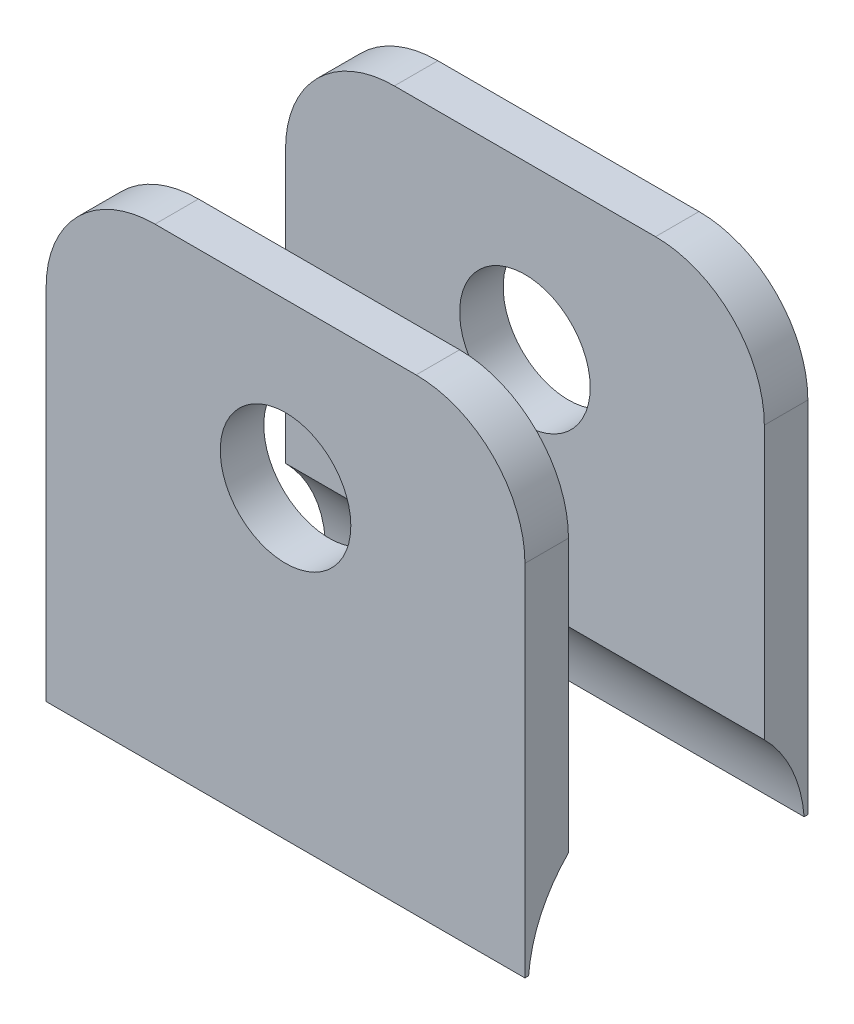
ISO-10303-21;
HEADER;
FILE_DESCRIPTION(('STEP AP214'),'2;1');
FILE_NAME('part.step','',(''),(''),'','','');
FILE_SCHEMA(('AUTOMOTIVE_DESIGN { 1 0 10303 214 1 1 1 1 }'));
ENDSEC;
DATA;
#1=APPLICATION_CONTEXT('core data for automotive mechanical design processes');
#2=APPLICATION_PROTOCOL_DEFINITION('international standard','automotive_design',2000,#1);
#3=PRODUCT_CONTEXT('',#1,'mechanical');
#4=PRODUCT('Part','Part','',(#3));
#5=PRODUCT_RELATED_PRODUCT_CATEGORY('part','',(#4));
#6=PRODUCT_DEFINITION_FORMATION('','',#4);
#7=PRODUCT_DEFINITION_CONTEXT('part definition',#1,'design');
#8=PRODUCT_DEFINITION('design','',#6,#7);
#9=PRODUCT_DEFINITION_SHAPE('','',#8);
#10=(LENGTH_UNIT() NAMED_UNIT(*) SI_UNIT(.MILLI.,.METRE.));
#11=(NAMED_UNIT(*) PLANE_ANGLE_UNIT() SI_UNIT($,.RADIAN.));
#12=(NAMED_UNIT(*) SI_UNIT($,.STERADIAN.) SOLID_ANGLE_UNIT());
#13=UNCERTAINTY_MEASURE_WITH_UNIT(LENGTH_MEASURE(1.E-05),#10,'distance_accuracy_value','');
#14=(GEOMETRIC_REPRESENTATION_CONTEXT(3) GLOBAL_UNCERTAINTY_ASSIGNED_CONTEXT((#13)) GLOBAL_UNIT_ASSIGNED_CONTEXT((#10,
#11,#12)) REPRESENTATION_CONTEXT('',''));
#15=CARTESIAN_POINT('',(0.,0.,0.));
#16=DIRECTION('',(0.,0.,1.));
#17=DIRECTION('',(1.,0.,0.));
#18=AXIS2_PLACEMENT_3D('',#15,#16,#17);
#19=CARTESIAN_POINT('',(0.,0.,-9.));
#20=DIRECTION('',(0.,0.,1.));
#21=DIRECTION('',(-1.,0.,0.));
#22=AXIS2_PLACEMENT_3D('',#19,#20,#21);
#23=PLANE('',#22);
#24=CARTESIAN_POINT('',(0.,0.,-9.));
#25=DIRECTION('',(0.,0.,1.));
#26=DIRECTION('',(1.,0.,0.));
#27=AXIS2_PLACEMENT_3D('',#24,#25,#26);
#28=CIRCLE('',#27,6.);
#29=CARTESIAN_POINT('',(5.99999999999999,0.,-9.));
#30=VERTEX_POINT('',#29);
#31=EDGE_CURVE('E165',#30,#30,#28,.T.);
#32=ORIENTED_EDGE('',*,*,#31,.F.);
#33=EDGE_LOOP('',(#32));
#34=FACE_BOUND('',#33,.T.);
#35=DIRECTION('',(0.,-1.,0.));
#36=VECTOR('',#35,1.);
#37=CARTESIAN_POINT('',(-22.,0.,-9.));
#38=LINE('',#37,#36);
#39=CARTESIAN_POINT('',(-22.,5.,-9.));
#40=VERTEX_POINT('',#39);
#41=CARTESIAN_POINT('',(-22.,-20.0395312622609,-9.));
#42=VERTEX_POINT('',#41);
#43=EDGE_CURVE('E146',#40,#42,#38,.T.);
#44=ORIENTED_EDGE('',*,*,#43,.T.);
#45=DIRECTION('',(-1.,0.,0.));
#46=VECTOR('',#45,1.);
#47=CARTESIAN_POINT('',(25.,-20.0395312622609,-9.));
#48=LINE('',#47,#46);
#49=CARTESIAN_POINT('',(22.,-20.0395312622609,-9.));
#50=VERTEX_POINT('',#49);
#51=EDGE_CURVE('E63',#42,#50,#48,.F.);
#52=ORIENTED_EDGE('',*,*,#51,.T.);
#53=DIRECTION('',(0.,1.,0.));
#54=VECTOR('',#53,1.);
#55=CARTESIAN_POINT('',(22.,15.,-9.));
#56=LINE('',#55,#54);
#57=CARTESIAN_POINT('',(22.,5.,-9.));
#58=VERTEX_POINT('',#57);
#59=EDGE_CURVE('E152',#50,#58,#56,.T.);
#60=ORIENTED_EDGE('',*,*,#59,.T.);
#61=CARTESIAN_POINT('',(12.,5.,-9.));
#62=DIRECTION('',(0.,0.,-1.));
#63=DIRECTION('',(-1.,0.,0.));
#64=AXIS2_PLACEMENT_3D('',#61,#62,#63);
#65=CIRCLE('',#64,10.);
#66=CARTESIAN_POINT('',(12.,15.,-9.));
#67=VERTEX_POINT('',#66);
#68=EDGE_CURVE('E133',#67,#58,#65,.T.);
#69=ORIENTED_EDGE('',*,*,#68,.F.);
#70=DIRECTION('',(-1.,0.,0.));
#71=VECTOR('',#70,1.);
#72=CARTESIAN_POINT('',(-22.,15.,-9.));
#73=LINE('',#72,#71);
#74=CARTESIAN_POINT('',(-12.,15.,-9.));
#75=VERTEX_POINT('',#74);
#76=EDGE_CURVE('E148',#67,#75,#73,.T.);
#77=ORIENTED_EDGE('',*,*,#76,.T.);
#78=CARTESIAN_POINT('',(-12.,5.,-9.));
#79=DIRECTION('',(0.,0.,-1.));
#80=DIRECTION('',(-1.,0.,0.));
#81=AXIS2_PLACEMENT_3D('',#78,#79,#80);
#82=CIRCLE('',#81,10.);
#83=EDGE_CURVE('E130',#40,#75,#82,.T.);
#84=ORIENTED_EDGE('',*,*,#83,.F.);
#85=EDGE_LOOP('',(#44,#52,#60,#69,#77,#84));
#86=FACE_BOUND('',#85,.T.);
#87=ADVANCED_FACE('F49',(#34,#86),#23,.T.);
#88=CARTESIAN_POINT('',(22.,-28.,-13.));
#89=DIRECTION('',(0.,1.,0.));
#90=DIRECTION('',(0.,0.,-1.));
#91=AXIS2_PLACEMENT_3D('',#88,#89,#90);
#92=PLANE('',#91);
#93=DIRECTION('',(-1.,0.,0.));
#94=VECTOR('',#93,1.);
#95=CARTESIAN_POINT('',(25.,-28.,-12.6605687076055));
#96=LINE('',#95,#94);
#97=CARTESIAN_POINT('',(-22.,-28.,-12.6605687076055));
#98=VERTEX_POINT('',#97);
#99=CARTESIAN_POINT('',(22.,-28.,-12.6605687076055));
#100=VERTEX_POINT('',#99);
#101=EDGE_CURVE('E106',#98,#100,#96,.F.);
#102=ORIENTED_EDGE('',*,*,#101,.F.);
#103=DIRECTION('',(0.,0.,1.));
#104=VECTOR('',#103,1.);
#105=CARTESIAN_POINT('',(-22.,-28.,-13.));
#106=LINE('',#105,#104);
#107=CARTESIAN_POINT('',(-22.,-28.,-13.));
#108=VERTEX_POINT('',#107);
#109=EDGE_CURVE('E114',#108,#98,#106,.T.);
#110=ORIENTED_EDGE('',*,*,#109,.F.);
#111=DIRECTION('',(1.,0.,0.));
#112=VECTOR('',#111,1.);
#113=CARTESIAN_POINT('',(22.,-28.,-13.));
#114=LINE('',#113,#112);
#115=CARTESIAN_POINT('',(22.,-28.,-13.));
#116=VERTEX_POINT('',#115);
#117=EDGE_CURVE('E162',#108,#116,#114,.T.);
#118=ORIENTED_EDGE('',*,*,#117,.T.);
#119=DIRECTION('',(0.,0.,1.));
#120=VECTOR('',#119,1.);
#121=CARTESIAN_POINT('',(22.,-28.,-13.));
#122=LINE('',#121,#120);
#123=EDGE_CURVE('E115',#116,#100,#122,.T.);
#124=ORIENTED_EDGE('',*,*,#123,.T.);
#125=EDGE_LOOP('',(#102,#110,#118,#124));
#126=FACE_BOUND('',#125,.T.);
#127=ADVANCED_FACE('F112',(#126),#92,.F.);
#128=CARTESIAN_POINT('',(0.,0.,-13.));
#129=DIRECTION('',(0.,0.,1.));
#130=DIRECTION('',(-1.,0.,0.));
#131=AXIS2_PLACEMENT_3D('',#128,#129,#130);
#132=PLANE('',#131);
#133=DIRECTION('',(0.,1.,0.));
#134=VECTOR('',#133,1.);
#135=CARTESIAN_POINT('',(22.,15.,-13.));
#136=LINE('',#135,#134);
#137=CARTESIAN_POINT('',(22.,5.,-13.));
#138=VERTEX_POINT('',#137);
#139=EDGE_CURVE('E159',#116,#138,#136,.T.);
#140=ORIENTED_EDGE('',*,*,#139,.F.);
#141=ORIENTED_EDGE('',*,*,#117,.F.);
#142=DIRECTION('',(0.,-1.,0.));
#143=VECTOR('',#142,1.);
#144=CARTESIAN_POINT('',(-22.,-28.,-13.));
#145=LINE('',#144,#143);
#146=CARTESIAN_POINT('',(-22.,5.,-13.));
#147=VERTEX_POINT('',#146);
#148=EDGE_CURVE('E119',#147,#108,#145,.T.);
#149=ORIENTED_EDGE('',*,*,#148,.F.);
#150=CARTESIAN_POINT('',(-12.,5.,-13.));
#151=DIRECTION('',(0.,0.,-1.));
#152=DIRECTION('',(-1.,0.,0.));
#153=AXIS2_PLACEMENT_3D('',#150,#151,#152);
#154=CIRCLE('',#153,10.);
#155=CARTESIAN_POINT('',(-12.,15.,-13.));
#156=VERTEX_POINT('',#155);
#157=EDGE_CURVE('E138',#156,#147,#154,.F.);
#158=ORIENTED_EDGE('',*,*,#157,.F.);
#159=DIRECTION('',(-1.,0.,0.));
#160=VECTOR('',#159,1.);
#161=CARTESIAN_POINT('',(-22.,15.,-13.));
#162=LINE('',#161,#160);
#163=CARTESIAN_POINT('',(12.,15.,-13.));
#164=VERTEX_POINT('',#163);
#165=EDGE_CURVE('E125',#164,#156,#162,.T.);
#166=ORIENTED_EDGE('',*,*,#165,.F.);
#167=CARTESIAN_POINT('',(12.,5.,-13.));
#168=DIRECTION('',(0.,0.,-1.));
#169=DIRECTION('',(-1.,0.,0.));
#170=AXIS2_PLACEMENT_3D('',#167,#168,#169);
#171=CIRCLE('',#170,10.);
#172=EDGE_CURVE('E140',#138,#164,#171,.F.);
#173=ORIENTED_EDGE('',*,*,#172,.F.);
#174=EDGE_LOOP('',(#140,#141,#149,#158,#166,#173));
#175=FACE_BOUND('',#174,.T.);
#176=CARTESIAN_POINT('',(0.,0.,-13.));
#177=DIRECTION('',(0.,0.,1.));
#178=DIRECTION('',(1.,0.,0.));
#179=AXIS2_PLACEMENT_3D('',#176,#177,#178);
#180=CIRCLE('',#179,6.);
#181=CARTESIAN_POINT('',(5.99999999999999,0.,-13.));
#182=VERTEX_POINT('',#181);
#183=EDGE_CURVE('E154',#182,#182,#180,.T.);
#184=ORIENTED_EDGE('',*,*,#183,.T.);
#185=EDGE_LOOP('',(#184));
#186=FACE_BOUND('',#185,.T.);
#187=ADVANCED_FACE('F183',(#175,#186),#132,.F.);
#188=CARTESIAN_POINT('',(22.,15.,-13.));
#189=DIRECTION('',(-1.,0.,0.));
#190=DIRECTION('',(0.,0.,-1.));
#191=AXIS2_PLACEMENT_3D('',#188,#189,#190);
#192=PLANE('',#191);
#193=CARTESIAN_POINT('',(22.,-29.,0.));
#194=DIRECTION('',(-1.,0.,0.));
#195=DIRECTION('',(0.,0.,1.));
#196=AXIS2_PLACEMENT_3D('',#193,#194,#195);
#197=CIRCLE('',#196,12.7);
#198=EDGE_CURVE('E168',#100,#50,#197,.F.);
#199=ORIENTED_EDGE('',*,*,#198,.F.);
#200=ORIENTED_EDGE('',*,*,#123,.F.);
#201=ORIENTED_EDGE('',*,*,#139,.T.);
#202=DIRECTION('',(0.,0.,1.));
#203=VECTOR('',#202,1.);
#204=CARTESIAN_POINT('',(22.,5.,-13.));
#205=LINE('',#204,#203);
#206=EDGE_CURVE('E136',#58,#138,#205,.F.);
#207=ORIENTED_EDGE('',*,*,#206,.F.);
#208=ORIENTED_EDGE('',*,*,#59,.F.);
#209=EDGE_LOOP('',(#199,#200,#201,#207,#208));
#210=FACE_BOUND('',#209,.T.);
#211=ADVANCED_FACE('F175',(#210),#192,.F.);
#212=CARTESIAN_POINT('',(-22.,15.,-13.));
#213=DIRECTION('',(0.,-1.,0.));
#214=DIRECTION('',(0.,0.,1.));
#215=AXIS2_PLACEMENT_3D('',#212,#213,#214);
#216=PLANE('',#215);
#217=ORIENTED_EDGE('',*,*,#165,.T.);
#218=DIRECTION('',(0.,0.,1.));
#219=VECTOR('',#218,1.);
#220=CARTESIAN_POINT('',(-12.,15.,-13.));
#221=LINE('',#220,#219);
#222=EDGE_CURVE('E121',#75,#156,#221,.F.);
#223=ORIENTED_EDGE('',*,*,#222,.F.);
#224=ORIENTED_EDGE('',*,*,#76,.F.);
#225=DIRECTION('',(0.,0.,1.));
#226=VECTOR('',#225,1.);
#227=CARTESIAN_POINT('',(12.,15.,-13.));
#228=LINE('',#227,#226);
#229=EDGE_CURVE('E123',#164,#67,#228,.T.);
#230=ORIENTED_EDGE('',*,*,#229,.F.);
#231=EDGE_LOOP('',(#217,#223,#224,#230));
#232=FACE_BOUND('',#231,.T.);
#233=ADVANCED_FACE('F181',(#232),#216,.F.);
#234=CARTESIAN_POINT('',(-22.,0.,-13.));
#235=DIRECTION('',(1.,0.,0.));
#236=DIRECTION('',(0.,0.,1.));
#237=AXIS2_PLACEMENT_3D('',#234,#235,#236);
#238=PLANE('',#237);
#239=CARTESIAN_POINT('',(-22.,-29.,0.));
#240=DIRECTION('',(1.,0.,0.));
#241=DIRECTION('',(0.,0.,-1.));
#242=AXIS2_PLACEMENT_3D('',#239,#240,#241);
#243=CIRCLE('',#242,12.7);
#244=EDGE_CURVE('E12',#42,#98,#243,.F.);
#245=ORIENTED_EDGE('',*,*,#244,.F.);
#246=ORIENTED_EDGE('',*,*,#43,.F.);
#247=DIRECTION('',(0.,0.,1.));
#248=VECTOR('',#247,1.);
#249=CARTESIAN_POINT('',(-22.,5.,-13.));
#250=LINE('',#249,#248);
#251=EDGE_CURVE('E57',#147,#40,#250,.T.);
#252=ORIENTED_EDGE('',*,*,#251,.F.);
#253=ORIENTED_EDGE('',*,*,#148,.T.);
#254=ORIENTED_EDGE('',*,*,#109,.T.);
#255=EDGE_LOOP('',(#245,#246,#252,#253,#254));
#256=FACE_BOUND('',#255,.T.);
#257=ADVANCED_FACE('F117',(#256),#238,.F.);
#258=CARTESIAN_POINT('',(0.,0.,-13.));
#259=DIRECTION('',(0.,0.,1.));
#260=DIRECTION('',(-1.,0.,0.));
#261=AXIS2_PLACEMENT_3D('',#258,#259,#260);
#262=CYLINDRICAL_SURFACE('',#261,6.);
#263=ORIENTED_EDGE('',*,*,#183,.F.);
#264=EDGE_LOOP('',(#263));
#265=FACE_BOUND('',#264,.T.);
#266=ORIENTED_EDGE('',*,*,#31,.T.);
#267=EDGE_LOOP('',(#266));
#268=FACE_BOUND('',#267,.T.);
#269=ADVANCED_FACE('F189',(#265,#268),#262,.F.);
#270=CARTESIAN_POINT('',(12.,5.,-13.));
#271=DIRECTION('',(0.,0.,1.));
#272=DIRECTION('',(-1.,0.,0.));
#273=AXIS2_PLACEMENT_3D('',#270,#271,#272);
#274=CYLINDRICAL_SURFACE('',#273,10.);
#275=ORIENTED_EDGE('',*,*,#172,.T.);
#276=ORIENTED_EDGE('',*,*,#229,.T.);
#277=ORIENTED_EDGE('',*,*,#68,.T.);
#278=ORIENTED_EDGE('',*,*,#206,.T.);
#279=EDGE_LOOP('',(#275,#276,#277,#278));
#280=FACE_BOUND('',#279,.T.);
#281=ADVANCED_FACE('F179',(#280),#274,.T.);
#282=CARTESIAN_POINT('',(-12.,5.,-13.));
#283=DIRECTION('',(0.,0.,1.));
#284=DIRECTION('',(-1.,0.,0.));
#285=AXIS2_PLACEMENT_3D('',#282,#283,#284);
#286=CYLINDRICAL_SURFACE('',#285,10.);
#287=ORIENTED_EDGE('',*,*,#157,.T.);
#288=ORIENTED_EDGE('',*,*,#251,.T.);
#289=ORIENTED_EDGE('',*,*,#83,.T.);
#290=ORIENTED_EDGE('',*,*,#222,.T.);
#291=EDGE_LOOP('',(#287,#288,#289,#290));
#292=FACE_BOUND('',#291,.T.);
#293=ADVANCED_FACE('F51',(#292),#286,.T.);
#294=CARTESIAN_POINT('',(25.,-29.,0.));
#295=DIRECTION('',(-1.,0.,0.));
#296=DIRECTION('',(0.,0.,1.));
#297=AXIS2_PLACEMENT_3D('',#294,#295,#296);
#298=CYLINDRICAL_SURFACE('',#297,12.7);
#299=ORIENTED_EDGE('',*,*,#198,.T.);
#300=ORIENTED_EDGE('',*,*,#51,.F.);
#301=ORIENTED_EDGE('',*,*,#244,.T.);
#302=ORIENTED_EDGE('',*,*,#101,.T.);
#303=EDGE_LOOP('',(#299,#300,#301,#302));
#304=FACE_BOUND('',#303,.T.);
#305=ADVANCED_FACE('F105',(#304),#298,.F.);
#306=CLOSED_SHELL('',(#87,#127,#187,#211,#233,#257,#269,#281,#293,#305));
#307=MANIFOLD_SOLID_BREP('B2',#306);
#308=CARTESIAN_POINT('',(0.,0.,9.));
#309=DIRECTION('',(0.,0.,-1.));
#310=DIRECTION('',(-1.,0.,0.));
#311=AXIS2_PLACEMENT_3D('',#308,#309,#310);
#312=PLANE('',#311);
#313=CARTESIAN_POINT('',(0.,0.,9.));
#314=DIRECTION('',(0.,0.,1.));
#315=DIRECTION('',(1.,0.,0.));
#316=AXIS2_PLACEMENT_3D('',#313,#314,#315);
#317=CIRCLE('',#316,6.);
#318=CARTESIAN_POINT('',(5.99999999999999,0.,9.));
#319=VERTEX_POINT('',#318);
#320=EDGE_CURVE('E466',#319,#319,#317,.T.);
#321=ORIENTED_EDGE('',*,*,#320,.T.);
#322=EDGE_LOOP('',(#321));
#323=FACE_BOUND('',#322,.T.);
#324=DIRECTION('',(0.,1.,0.));
#325=VECTOR('',#324,1.);
#326=CARTESIAN_POINT('',(22.,15.,9.));
#327=LINE('',#326,#325);
#328=CARTESIAN_POINT('',(22.,-20.0395312622609,9.));
#329=VERTEX_POINT('',#328);
#330=CARTESIAN_POINT('',(22.,5.,9.));
#331=VERTEX_POINT('',#330);
#332=EDGE_CURVE('E384',#329,#331,#327,.T.);
#333=ORIENTED_EDGE('',*,*,#332,.F.);
#334=DIRECTION('',(-1.,0.,0.));
#335=VECTOR('',#334,1.);
#336=CARTESIAN_POINT('',(25.,-20.0395312622609,9.));
#337=LINE('',#336,#335);
#338=CARTESIAN_POINT('',(-22.,-20.0395312622609,9.));
#339=VERTEX_POINT('',#338);
#340=EDGE_CURVE('E373',#329,#339,#337,.T.);
#341=ORIENTED_EDGE('',*,*,#340,.T.);
#342=DIRECTION('',(0.,-1.,0.));
#343=VECTOR('',#342,1.);
#344=CARTESIAN_POINT('',(-22.,0.,9.));
#345=LINE('',#344,#343);
#346=CARTESIAN_POINT('',(-22.,5.,9.));
#347=VERTEX_POINT('',#346);
#348=EDGE_CURVE('E382',#347,#339,#345,.T.);
#349=ORIENTED_EDGE('',*,*,#348,.F.);
#350=CARTESIAN_POINT('',(-12.,5.,9.));
#351=DIRECTION('',(0.,0.,-1.));
#352=DIRECTION('',(-1.,0.,0.));
#353=AXIS2_PLACEMENT_3D('',#350,#351,#352);
#354=CIRCLE('',#353,10.);
#355=CARTESIAN_POINT('',(-12.,15.,9.));
#356=VERTEX_POINT('',#355);
#357=EDGE_CURVE('E410',#347,#356,#354,.T.);
#358=ORIENTED_EDGE('',*,*,#357,.T.);
#359=DIRECTION('',(-1.,0.,0.));
#360=VECTOR('',#359,1.);
#361=CARTESIAN_POINT('',(-22.,15.,9.));
#362=LINE('',#361,#360);
#363=CARTESIAN_POINT('',(12.,15.,9.));
#364=VERTEX_POINT('',#363);
#365=EDGE_CURVE('E391',#364,#356,#362,.T.);
#366=ORIENTED_EDGE('',*,*,#365,.F.);
#367=CARTESIAN_POINT('',(12.,5.,9.));
#368=DIRECTION('',(0.,0.,-1.));
#369=DIRECTION('',(-1.,0.,0.));
#370=AXIS2_PLACEMENT_3D('',#367,#368,#369);
#371=CIRCLE('',#370,10.);
#372=EDGE_CURVE('E412',#364,#331,#371,.T.);
#373=ORIENTED_EDGE('',*,*,#372,.T.);
#374=EDGE_LOOP('',(#333,#341,#349,#358,#366,#373));
#375=FACE_BOUND('',#374,.T.);
#376=ADVANCED_FACE('F315',(#323,#375),#312,.T.);
#377=CARTESIAN_POINT('',(22.,-28.,13.));
#378=DIRECTION('',(0.,1.,0.));
#379=DIRECTION('',(0.,0.,1.));
#380=AXIS2_PLACEMENT_3D('',#377,#378,#379);
#381=PLANE('',#380);
#382=DIRECTION('',(-1.,0.,0.));
#383=VECTOR('',#382,1.);
#384=CARTESIAN_POINT('',(25.,-28.,12.6605687076055));
#385=LINE('',#384,#383);
#386=CARTESIAN_POINT('',(22.,-28.,12.6605687076055));
#387=VERTEX_POINT('',#386);
#388=CARTESIAN_POINT('',(-22.,-28.,12.6605687076055));
#389=VERTEX_POINT('',#388);
#390=EDGE_CURVE('E329',#387,#389,#385,.T.);
#391=ORIENTED_EDGE('',*,*,#390,.F.);
#392=DIRECTION('',(0.,0.,-1.));
#393=VECTOR('',#392,1.);
#394=CARTESIAN_POINT('',(22.,-28.,13.));
#395=LINE('',#394,#393);
#396=CARTESIAN_POINT('',(22.,-28.,13.));
#397=VERTEX_POINT('',#396);
#398=EDGE_CURVE('E399',#397,#387,#395,.T.);
#399=ORIENTED_EDGE('',*,*,#398,.F.);
#400=DIRECTION('',(1.,0.,0.));
#401=VECTOR('',#400,1.);
#402=CARTESIAN_POINT('',(22.,-28.,13.));
#403=LINE('',#402,#401);
#404=CARTESIAN_POINT('',(-22.,-28.,13.));
#405=VERTEX_POINT('',#404);
#406=EDGE_CURVE('E393',#405,#397,#403,.T.);
#407=ORIENTED_EDGE('',*,*,#406,.F.);
#408=DIRECTION('',(0.,0.,-1.));
#409=VECTOR('',#408,1.);
#410=CARTESIAN_POINT('',(-22.,-28.,13.));
#411=LINE('',#410,#409);
#412=EDGE_CURVE('E402',#405,#389,#411,.T.);
#413=ORIENTED_EDGE('',*,*,#412,.T.);
#414=EDGE_LOOP('',(#391,#399,#407,#413));
#415=FACE_BOUND('',#414,.T.);
#416=ADVANCED_FACE('F443',(#415),#381,.F.);
#417=CARTESIAN_POINT('',(0.,0.,13.));
#418=DIRECTION('',(0.,0.,-1.));
#419=DIRECTION('',(-1.,0.,0.));
#420=AXIS2_PLACEMENT_3D('',#417,#418,#419);
#421=PLANE('',#420);
#422=DIRECTION('',(0.,1.,0.));
#423=VECTOR('',#422,1.);
#424=CARTESIAN_POINT('',(22.,15.,13.));
#425=LINE('',#424,#423);
#426=CARTESIAN_POINT('',(22.,5.,13.));
#427=VERTEX_POINT('',#426);
#428=EDGE_CURVE('E424',#397,#427,#425,.T.);
#429=ORIENTED_EDGE('',*,*,#428,.T.);
#430=CARTESIAN_POINT('',(12.,5.,13.));
#431=DIRECTION('',(0.,0.,-1.));
#432=DIRECTION('',(-1.,0.,0.));
#433=AXIS2_PLACEMENT_3D('',#430,#431,#432);
#434=CIRCLE('',#433,10.);
#435=CARTESIAN_POINT('',(12.,15.,13.));
#436=VERTEX_POINT('',#435);
#437=EDGE_CURVE('E417',#427,#436,#434,.F.);
#438=ORIENTED_EDGE('',*,*,#437,.T.);
#439=DIRECTION('',(-1.,0.,0.));
#440=VECTOR('',#439,1.);
#441=CARTESIAN_POINT('',(-22.,15.,13.));
#442=LINE('',#441,#440);
#443=CARTESIAN_POINT('',(-12.,15.,13.));
#444=VERTEX_POINT('',#443);
#445=EDGE_CURVE('E403',#436,#444,#442,.T.);
#446=ORIENTED_EDGE('',*,*,#445,.T.);
#447=CARTESIAN_POINT('',(-12.,5.,13.));
#448=DIRECTION('',(0.,0.,-1.));
#449=DIRECTION('',(-1.,0.,0.));
#450=AXIS2_PLACEMENT_3D('',#447,#448,#449);
#451=CIRCLE('',#450,10.);
#452=CARTESIAN_POINT('',(-22.,5.,13.));
#453=VERTEX_POINT('',#452);
#454=EDGE_CURVE('E337',#444,#453,#451,.F.);
#455=ORIENTED_EDGE('',*,*,#454,.T.);
#456=DIRECTION('',(0.,-1.,0.));
#457=VECTOR('',#456,1.);
#458=CARTESIAN_POINT('',(-22.,-28.,13.));
#459=LINE('',#458,#457);
#460=EDGE_CURVE('E390',#453,#405,#459,.T.);
#461=ORIENTED_EDGE('',*,*,#460,.T.);
#462=ORIENTED_EDGE('',*,*,#406,.T.);
#463=EDGE_LOOP('',(#429,#438,#446,#455,#461,#462));
#464=FACE_BOUND('',#463,.T.);
#465=CARTESIAN_POINT('',(0.,0.,13.));
#466=DIRECTION('',(0.,0.,1.));
#467=DIRECTION('',(1.,0.,0.));
#468=AXIS2_PLACEMENT_3D('',#465,#466,#467);
#469=CIRCLE('',#468,6.);
#470=CARTESIAN_POINT('',(5.99999999999999,0.,13.));
#471=VERTEX_POINT('',#470);
#472=EDGE_CURVE('E468',#471,#471,#469,.T.);
#473=ORIENTED_EDGE('',*,*,#472,.F.);
#474=EDGE_LOOP('',(#473));
#475=FACE_BOUND('',#474,.T.);
#476=ADVANCED_FACE('F421',(#464,#475),#421,.F.);
#477=CARTESIAN_POINT('',(22.,15.,13.));
#478=DIRECTION('',(-1.,0.,0.));
#479=DIRECTION('',(0.,0.,1.));
#480=AXIS2_PLACEMENT_3D('',#477,#478,#479);
#481=PLANE('',#480);
#482=CARTESIAN_POINT('',(22.,-29.,0.));
#483=DIRECTION('',(-1.,0.,0.));
#484=DIRECTION('',(0.,0.,1.));
#485=AXIS2_PLACEMENT_3D('',#482,#483,#484);
#486=CIRCLE('',#485,12.7);
#487=EDGE_CURVE('E385',#329,#387,#486,.F.);
#488=ORIENTED_EDGE('',*,*,#487,.F.);
#489=ORIENTED_EDGE('',*,*,#332,.T.);
#490=DIRECTION('',(0.,0.,-1.));
#491=VECTOR('',#490,1.);
#492=CARTESIAN_POINT('',(22.,5.,13.));
#493=LINE('',#492,#491);
#494=EDGE_CURVE('E414',#331,#427,#493,.F.);
#495=ORIENTED_EDGE('',*,*,#494,.T.);
#496=ORIENTED_EDGE('',*,*,#428,.F.);
#497=ORIENTED_EDGE('',*,*,#398,.T.);
#498=EDGE_LOOP('',(#488,#489,#495,#496,#497));
#499=FACE_BOUND('',#498,.T.);
#500=ADVANCED_FACE('F459',(#499),#481,.F.);
#501=CARTESIAN_POINT('',(-22.,15.,13.));
#502=DIRECTION('',(0.,-1.,0.));
#503=DIRECTION('',(0.,0.,-1.));
#504=AXIS2_PLACEMENT_3D('',#501,#502,#503);
#505=PLANE('',#504);
#506=ORIENTED_EDGE('',*,*,#445,.F.);
#507=DIRECTION('',(0.,0.,-1.));
#508=VECTOR('',#507,1.);
#509=CARTESIAN_POINT('',(12.,15.,13.));
#510=LINE('',#509,#508);
#511=EDGE_CURVE('E407',#436,#364,#510,.T.);
#512=ORIENTED_EDGE('',*,*,#511,.T.);
#513=ORIENTED_EDGE('',*,*,#365,.T.);
#514=DIRECTION('',(0.,0.,-1.));
#515=VECTOR('',#514,1.);
#516=CARTESIAN_POINT('',(-12.,15.,13.));
#517=LINE('',#516,#515);
#518=EDGE_CURVE('E405',#356,#444,#517,.F.);
#519=ORIENTED_EDGE('',*,*,#518,.T.);
#520=EDGE_LOOP('',(#506,#512,#513,#519));
#521=FACE_BOUND('',#520,.T.);
#522=ADVANCED_FACE('F429',(#521),#505,.F.);
#523=CARTESIAN_POINT('',(-22.,0.,13.));
#524=DIRECTION('',(1.,0.,0.));
#525=DIRECTION('',(0.,0.,-1.));
#526=AXIS2_PLACEMENT_3D('',#523,#524,#525);
#527=PLANE('',#526);
#528=CARTESIAN_POINT('',(-22.,-29.,0.));
#529=DIRECTION('',(1.,0.,0.));
#530=DIRECTION('',(0.,0.,-1.));
#531=AXIS2_PLACEMENT_3D('',#528,#529,#530);
#532=CIRCLE('',#531,12.7);
#533=EDGE_CURVE('E47',#389,#339,#532,.F.);
#534=ORIENTED_EDGE('',*,*,#533,.F.);
#535=ORIENTED_EDGE('',*,*,#412,.F.);
#536=ORIENTED_EDGE('',*,*,#460,.F.);
#537=DIRECTION('',(0.,0.,-1.));
#538=VECTOR('',#537,1.);
#539=CARTESIAN_POINT('',(-22.,5.,13.));
#540=LINE('',#539,#538);
#541=EDGE_CURVE('E323',#453,#347,#540,.T.);
#542=ORIENTED_EDGE('',*,*,#541,.T.);
#543=ORIENTED_EDGE('',*,*,#348,.T.);
#544=EDGE_LOOP('',(#534,#535,#536,#542,#543));
#545=FACE_BOUND('',#544,.T.);
#546=ADVANCED_FACE('F388',(#545),#527,.F.);
#547=CARTESIAN_POINT('',(0.,0.,13.));
#548=DIRECTION('',(0.,0.,-1.));
#549=DIRECTION('',(-1.,0.,0.));
#550=AXIS2_PLACEMENT_3D('',#547,#548,#549);
#551=CYLINDRICAL_SURFACE('',#550,6.);
#552=ORIENTED_EDGE('',*,*,#472,.T.);
#553=EDGE_LOOP('',(#552));
#554=FACE_BOUND('',#553,.T.);
#555=ORIENTED_EDGE('',*,*,#320,.F.);
#556=EDGE_LOOP('',(#555));
#557=FACE_BOUND('',#556,.T.);
#558=ADVANCED_FACE('F441',(#554,#557),#551,.F.);
#559=CARTESIAN_POINT('',(12.,5.,13.));
#560=DIRECTION('',(0.,0.,-1.));
#561=DIRECTION('',(-1.,0.,0.));
#562=AXIS2_PLACEMENT_3D('',#559,#560,#561);
#563=CYLINDRICAL_SURFACE('',#562,10.);
#564=ORIENTED_EDGE('',*,*,#437,.F.);
#565=ORIENTED_EDGE('',*,*,#494,.F.);
#566=ORIENTED_EDGE('',*,*,#372,.F.);
#567=ORIENTED_EDGE('',*,*,#511,.F.);
#568=EDGE_LOOP('',(#564,#565,#566,#567));
#569=FACE_BOUND('',#568,.T.);
#570=ADVANCED_FACE('F433',(#569),#563,.T.);
#571=CARTESIAN_POINT('',(-12.,5.,13.));
#572=DIRECTION('',(0.,0.,-1.));
#573=DIRECTION('',(-1.,0.,0.));
#574=AXIS2_PLACEMENT_3D('',#571,#572,#573);
#575=CYLINDRICAL_SURFACE('',#574,10.);
#576=ORIENTED_EDGE('',*,*,#454,.F.);
#577=ORIENTED_EDGE('',*,*,#518,.F.);
#578=ORIENTED_EDGE('',*,*,#357,.F.);
#579=ORIENTED_EDGE('',*,*,#541,.F.);
#580=EDGE_LOOP('',(#576,#577,#578,#579));
#581=FACE_BOUND('',#580,.T.);
#582=ADVANCED_FACE('F317',(#581),#575,.T.);
#583=CARTESIAN_POINT('',(25.,-29.,0.));
#584=DIRECTION('',(-1.,0.,0.));
#585=DIRECTION('',(0.,0.,1.));
#586=AXIS2_PLACEMENT_3D('',#583,#584,#585);
#587=CYLINDRICAL_SURFACE('',#586,12.7);
#588=ORIENTED_EDGE('',*,*,#487,.T.);
#589=ORIENTED_EDGE('',*,*,#390,.T.);
#590=ORIENTED_EDGE('',*,*,#533,.T.);
#591=ORIENTED_EDGE('',*,*,#340,.F.);
#592=EDGE_LOOP('',(#588,#589,#590,#591));
#593=FACE_BOUND('',#592,.T.);
#594=ADVANCED_FACE('F372',(#593),#587,.F.);
#595=CLOSED_SHELL('',(#376,#416,#476,#500,#522,#546,#558,#570,#582,#594));
#596=MANIFOLD_SOLID_BREP('B6',#595);
#597=ADVANCED_BREP_SHAPE_REPRESENTATION('',(#18,#307,#596),#14);
#598=SHAPE_DEFINITION_REPRESENTATION(#9,#597);
ENDSEC;
END-ISO-10303-21;
